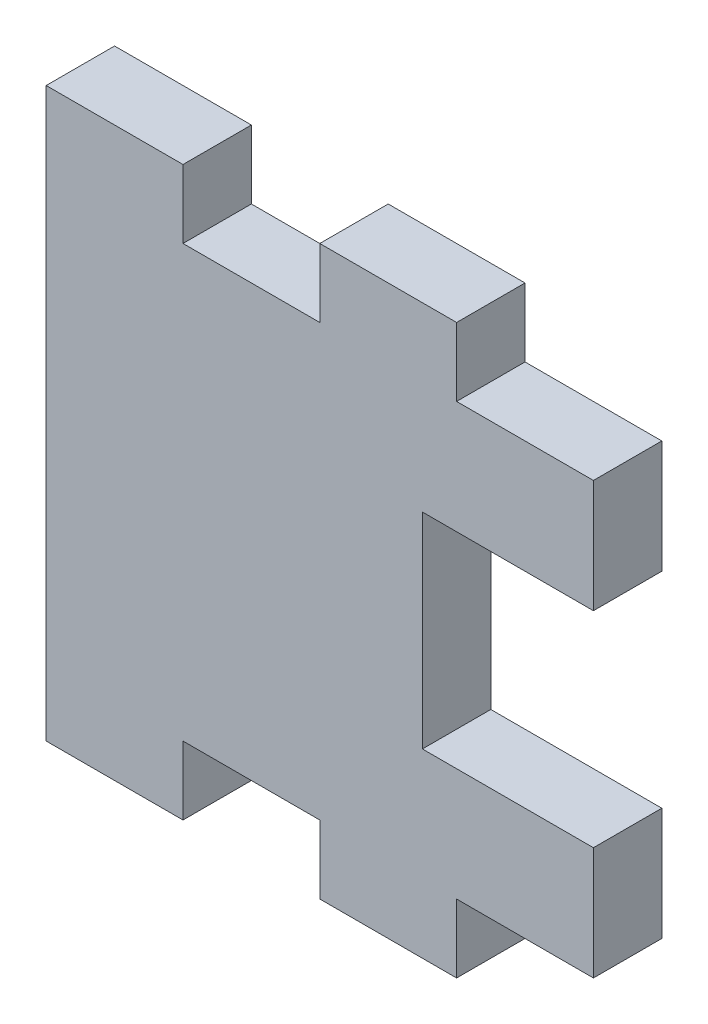
ISO-10303-21;
HEADER;
FILE_DESCRIPTION(('STEP AP214'),'2;1');
FILE_NAME('part.step','',(''),(''),'','','');
FILE_SCHEMA(('AUTOMOTIVE_DESIGN { 1 0 10303 214 1 1 1 1 }'));
ENDSEC;
DATA;
#1=APPLICATION_CONTEXT('core data for automotive mechanical design processes');
#2=APPLICATION_PROTOCOL_DEFINITION('international standard','automotive_design',2000,#1);
#3=PRODUCT_CONTEXT('',#1,'mechanical');
#4=PRODUCT('Part','Part','',(#3));
#5=PRODUCT_RELATED_PRODUCT_CATEGORY('part','',(#4));
#6=PRODUCT_DEFINITION_FORMATION('','',#4);
#7=PRODUCT_DEFINITION_CONTEXT('part definition',#1,'design');
#8=PRODUCT_DEFINITION('design','',#6,#7);
#9=PRODUCT_DEFINITION_SHAPE('','',#8);
#10=(LENGTH_UNIT() NAMED_UNIT(*) SI_UNIT(.MILLI.,.METRE.));
#11=(NAMED_UNIT(*) PLANE_ANGLE_UNIT() SI_UNIT($,.RADIAN.));
#12=(NAMED_UNIT(*) SI_UNIT($,.STERADIAN.) SOLID_ANGLE_UNIT());
#13=UNCERTAINTY_MEASURE_WITH_UNIT(LENGTH_MEASURE(1.E-05),#10,'distance_accuracy_value','');
#14=(GEOMETRIC_REPRESENTATION_CONTEXT(3) GLOBAL_UNCERTAINTY_ASSIGNED_CONTEXT((#13)) GLOBAL_UNIT_ASSIGNED_CONTEXT((#10,
#11,#12)) REPRESENTATION_CONTEXT('',''));
#15=CARTESIAN_POINT('',(0.,0.,0.));
#16=DIRECTION('',(0.,0.,1.));
#17=DIRECTION('',(1.,0.,0.));
#18=AXIS2_PLACEMENT_3D('',#15,#16,#17);
#19=CARTESIAN_POINT('',(0.,-3.175,3.175));
#20=DIRECTION('',(0.,1.,0.));
#21=DIRECTION('',(0.,0.,1.));
#22=AXIS2_PLACEMENT_3D('',#19,#20,#21);
#23=PLANE('',#22);
#24=DIRECTION('',(1.,0.,0.));
#25=VECTOR('',#24,1.);
#26=CARTESIAN_POINT('',(0.,-3.175,0.));
#27=LINE('',#26,#25);
#28=CARTESIAN_POINT('',(0.,-3.175,0.));
#29=VERTEX_POINT('',#28);
#30=CARTESIAN_POINT('',(6.35,-3.175,0.));
#31=VERTEX_POINT('',#30);
#32=EDGE_CURVE('E204',#29,#31,#27,.T.);
#33=ORIENTED_EDGE('',*,*,#32,.T.);
#34=DIRECTION('',(0.,0.,-1.));
#35=VECTOR('',#34,1.);
#36=CARTESIAN_POINT('',(6.35,-3.175,3.175));
#37=LINE('',#36,#35);
#38=CARTESIAN_POINT('',(6.35,-3.175,3.175));
#39=VERTEX_POINT('',#38);
#40=EDGE_CURVE('E43',#39,#31,#37,.T.);
#41=ORIENTED_EDGE('',*,*,#40,.F.);
#42=DIRECTION('',(1.,0.,0.));
#43=VECTOR('',#42,1.);
#44=CARTESIAN_POINT('',(0.,-3.175,3.175));
#45=LINE('',#44,#43);
#46=CARTESIAN_POINT('',(0.,-3.175,3.175));
#47=VERTEX_POINT('',#46);
#48=EDGE_CURVE('E349',#47,#39,#45,.T.);
#49=ORIENTED_EDGE('',*,*,#48,.F.);
#50=DIRECTION('',(0.,0.,-1.));
#51=VECTOR('',#50,1.);
#52=CARTESIAN_POINT('',(0.,-3.175,3.175));
#53=LINE('',#52,#51);
#54=EDGE_CURVE('E11',#47,#29,#53,.T.);
#55=ORIENTED_EDGE('',*,*,#54,.T.);
#56=EDGE_LOOP('',(#33,#41,#49,#55));
#57=FACE_BOUND('',#56,.T.);
#58=ADVANCED_FACE('F35',(#57),#23,.F.);
#59=CARTESIAN_POINT('',(6.35,-3.175,3.175));
#60=DIRECTION('',(-1.,0.,0.));
#61=DIRECTION('',(0.,0.,1.));
#62=AXIS2_PLACEMENT_3D('',#59,#60,#61);
#63=PLANE('',#62);
#64=DIRECTION('',(0.,1.,0.));
#65=VECTOR('',#64,1.);
#66=CARTESIAN_POINT('',(6.35,-3.175,0.));
#67=LINE('',#66,#65);
#68=CARTESIAN_POINT('',(6.35,0.,0.));
#69=VERTEX_POINT('',#68);
#70=EDGE_CURVE('E206',#31,#69,#67,.T.);
#71=ORIENTED_EDGE('',*,*,#70,.T.);
#72=DIRECTION('',(0.,0.,-1.));
#73=VECTOR('',#72,1.);
#74=CARTESIAN_POINT('',(6.35,0.,3.175));
#75=LINE('',#74,#73);
#76=CARTESIAN_POINT('',(6.35,0.,3.175));
#77=VERTEX_POINT('',#76);
#78=EDGE_CURVE('E283',#77,#69,#75,.T.);
#79=ORIENTED_EDGE('',*,*,#78,.F.);
#80=DIRECTION('',(0.,1.,0.));
#81=VECTOR('',#80,1.);
#82=CARTESIAN_POINT('',(6.35,-3.175,3.175));
#83=LINE('',#82,#81);
#84=EDGE_CURVE('E292',#39,#77,#83,.T.);
#85=ORIENTED_EDGE('',*,*,#84,.F.);
#86=ORIENTED_EDGE('',*,*,#40,.T.);
#87=EDGE_LOOP('',(#71,#79,#85,#86));
#88=FACE_BOUND('',#87,.T.);
#89=ADVANCED_FACE('F290',(#88),#63,.F.);
#90=CARTESIAN_POINT('',(6.35,0.,3.175));
#91=DIRECTION('',(0.,1.,0.));
#92=DIRECTION('',(0.,0.,1.));
#93=AXIS2_PLACEMENT_3D('',#90,#91,#92);
#94=PLANE('',#93);
#95=DIRECTION('',(1.,0.,0.));
#96=VECTOR('',#95,1.);
#97=CARTESIAN_POINT('',(6.35,0.,0.));
#98=LINE('',#97,#96);
#99=CARTESIAN_POINT('',(12.7,0.,0.));
#100=VERTEX_POINT('',#99);
#101=EDGE_CURVE('E208',#69,#100,#98,.T.);
#102=ORIENTED_EDGE('',*,*,#101,.T.);
#103=DIRECTION('',(0.,0.,-1.));
#104=VECTOR('',#103,1.);
#105=CARTESIAN_POINT('',(12.7,0.,3.175));
#106=LINE('',#105,#104);
#107=CARTESIAN_POINT('',(12.7,0.,3.175));
#108=VERTEX_POINT('',#107);
#109=EDGE_CURVE('E280',#108,#100,#106,.T.);
#110=ORIENTED_EDGE('',*,*,#109,.F.);
#111=DIRECTION('',(1.,0.,0.));
#112=VECTOR('',#111,1.);
#113=CARTESIAN_POINT('',(6.35,0.,3.175));
#114=LINE('',#113,#112);
#115=EDGE_CURVE('E310',#77,#108,#114,.T.);
#116=ORIENTED_EDGE('',*,*,#115,.F.);
#117=ORIENTED_EDGE('',*,*,#78,.T.);
#118=EDGE_LOOP('',(#102,#110,#116,#117));
#119=FACE_BOUND('',#118,.T.);
#120=ADVANCED_FACE('F301',(#119),#94,.F.);
#121=CARTESIAN_POINT('',(12.7,0.,3.175));
#122=DIRECTION('',(1.,0.,0.));
#123=DIRECTION('',(0.,0.,-1.));
#124=AXIS2_PLACEMENT_3D('',#121,#122,#123);
#125=PLANE('',#124);
#126=DIRECTION('',(0.,-1.,0.));
#127=VECTOR('',#126,1.);
#128=CARTESIAN_POINT('',(12.7,0.,0.));
#129=LINE('',#128,#127);
#130=CARTESIAN_POINT('',(12.7,-3.175,0.));
#131=VERTEX_POINT('',#130);
#132=EDGE_CURVE('E210',#100,#131,#129,.T.);
#133=ORIENTED_EDGE('',*,*,#132,.T.);
#134=DIRECTION('',(0.,0.,-1.));
#135=VECTOR('',#134,1.);
#136=CARTESIAN_POINT('',(12.7,-3.175,3.175));
#137=LINE('',#136,#135);
#138=CARTESIAN_POINT('',(12.7,-3.175,3.175));
#139=VERTEX_POINT('',#138);
#140=EDGE_CURVE('E277',#139,#131,#137,.T.);
#141=ORIENTED_EDGE('',*,*,#140,.F.);
#142=DIRECTION('',(0.,-1.,0.));
#143=VECTOR('',#142,1.);
#144=CARTESIAN_POINT('',(12.7,0.,3.175));
#145=LINE('',#144,#143);
#146=EDGE_CURVE('E307',#108,#139,#145,.T.);
#147=ORIENTED_EDGE('',*,*,#146,.F.);
#148=ORIENTED_EDGE('',*,*,#109,.T.);
#149=EDGE_LOOP('',(#133,#141,#147,#148));
#150=FACE_BOUND('',#149,.T.);
#151=ADVANCED_FACE('F305',(#150),#125,.F.);
#152=CARTESIAN_POINT('',(12.7,-3.175,3.175));
#153=DIRECTION('',(0.,1.,0.));
#154=DIRECTION('',(-1.,0.,0.));
#155=AXIS2_PLACEMENT_3D('',#152,#153,#154);
#156=PLANE('',#155);
#157=DIRECTION('',(1.,0.,0.));
#158=VECTOR('',#157,1.);
#159=CARTESIAN_POINT('',(12.7,-3.175,0.));
#160=LINE('',#159,#158);
#161=CARTESIAN_POINT('',(19.05,-3.175,0.));
#162=VERTEX_POINT('',#161);
#163=EDGE_CURVE('E212',#131,#162,#160,.T.);
#164=ORIENTED_EDGE('',*,*,#163,.T.);
#165=DIRECTION('',(0.,0.,-1.));
#166=VECTOR('',#165,1.);
#167=CARTESIAN_POINT('',(19.05,-3.175,3.175));
#168=LINE('',#167,#166);
#169=CARTESIAN_POINT('',(19.05,-3.175,3.175));
#170=VERTEX_POINT('',#169);
#171=EDGE_CURVE('E274',#170,#162,#168,.T.);
#172=ORIENTED_EDGE('',*,*,#171,.F.);
#173=DIRECTION('',(1.,0.,0.));
#174=VECTOR('',#173,1.);
#175=CARTESIAN_POINT('',(12.7,-3.175,3.175));
#176=LINE('',#175,#174);
#177=EDGE_CURVE('E309',#139,#170,#176,.T.);
#178=ORIENTED_EDGE('',*,*,#177,.F.);
#179=ORIENTED_EDGE('',*,*,#140,.T.);
#180=EDGE_LOOP('',(#164,#172,#178,#179));
#181=FACE_BOUND('',#180,.T.);
#182=ADVANCED_FACE('F363',(#181),#156,.F.);
#183=CARTESIAN_POINT('',(19.05,-3.175,3.175));
#184=DIRECTION('',(-1.,0.,0.));
#185=DIRECTION('',(0.,0.,1.));
#186=AXIS2_PLACEMENT_3D('',#183,#184,#185);
#187=PLANE('',#186);
#188=DIRECTION('',(0.,1.,0.));
#189=VECTOR('',#188,1.);
#190=CARTESIAN_POINT('',(19.05,-3.175,0.));
#191=LINE('',#190,#189);
#192=CARTESIAN_POINT('',(19.05,0.,0.));
#193=VERTEX_POINT('',#192);
#194=EDGE_CURVE('E214',#162,#193,#191,.T.);
#195=ORIENTED_EDGE('',*,*,#194,.T.);
#196=DIRECTION('',(0.,0.,-1.));
#197=VECTOR('',#196,1.);
#198=CARTESIAN_POINT('',(19.05,0.,3.175));
#199=LINE('',#198,#197);
#200=CARTESIAN_POINT('',(19.05,0.,3.175));
#201=VERTEX_POINT('',#200);
#202=EDGE_CURVE('E271',#201,#193,#199,.T.);
#203=ORIENTED_EDGE('',*,*,#202,.F.);
#204=DIRECTION('',(0.,1.,0.));
#205=VECTOR('',#204,1.);
#206=CARTESIAN_POINT('',(19.05,-3.175,3.175));
#207=LINE('',#206,#205);
#208=EDGE_CURVE('E312',#170,#201,#207,.T.);
#209=ORIENTED_EDGE('',*,*,#208,.F.);
#210=ORIENTED_EDGE('',*,*,#171,.T.);
#211=EDGE_LOOP('',(#195,#203,#209,#210));
#212=FACE_BOUND('',#211,.T.);
#213=ADVANCED_FACE('F366',(#212),#187,.F.);
#214=CARTESIAN_POINT('',(19.05,0.,3.175));
#215=DIRECTION('',(0.,1.,0.));
#216=DIRECTION('',(0.,0.,1.));
#217=AXIS2_PLACEMENT_3D('',#214,#215,#216);
#218=PLANE('',#217);
#219=DIRECTION('',(1.,0.,0.));
#220=VECTOR('',#219,1.);
#221=CARTESIAN_POINT('',(19.05,0.,0.));
#222=LINE('',#221,#220);
#223=CARTESIAN_POINT('',(25.4,0.,0.));
#224=VERTEX_POINT('',#223);
#225=EDGE_CURVE('E216',#193,#224,#222,.T.);
#226=ORIENTED_EDGE('',*,*,#225,.T.);
#227=DIRECTION('',(0.,0.,-1.));
#228=VECTOR('',#227,1.);
#229=CARTESIAN_POINT('',(25.4,0.,3.175));
#230=LINE('',#229,#228);
#231=CARTESIAN_POINT('',(25.4,0.,3.175));
#232=VERTEX_POINT('',#231);
#233=EDGE_CURVE('E268',#232,#224,#230,.T.);
#234=ORIENTED_EDGE('',*,*,#233,.F.);
#235=DIRECTION('',(1.,0.,0.));
#236=VECTOR('',#235,1.);
#237=CARTESIAN_POINT('',(19.05,0.,3.175));
#238=LINE('',#237,#236);
#239=EDGE_CURVE('E318',#201,#232,#238,.T.);
#240=ORIENTED_EDGE('',*,*,#239,.F.);
#241=ORIENTED_EDGE('',*,*,#202,.T.);
#242=EDGE_LOOP('',(#226,#234,#240,#241));
#243=FACE_BOUND('',#242,.T.);
#244=ADVANCED_FACE('F370',(#243),#218,.F.);
#245=CARTESIAN_POINT('',(25.4,0.,3.175));
#246=DIRECTION('',(-1.,0.,0.));
#247=DIRECTION('',(0.,-1.,0.));
#248=AXIS2_PLACEMENT_3D('',#245,#246,#247);
#249=PLANE('',#248);
#250=DIRECTION('',(0.,1.,0.));
#251=VECTOR('',#250,1.);
#252=CARTESIAN_POINT('',(25.4,0.,0.));
#253=LINE('',#252,#251);
#254=CARTESIAN_POINT('',(25.4,5.2375,0.));
#255=VERTEX_POINT('',#254);
#256=EDGE_CURVE('E218',#224,#255,#253,.T.);
#257=ORIENTED_EDGE('',*,*,#256,.T.);
#258=DIRECTION('',(0.,0.,-1.));
#259=VECTOR('',#258,1.);
#260=CARTESIAN_POINT('',(25.4,5.2375,3.175));
#261=LINE('',#260,#259);
#262=CARTESIAN_POINT('',(25.4,5.2375,3.175));
#263=VERTEX_POINT('',#262);
#264=EDGE_CURVE('E265',#263,#255,#261,.T.);
#265=ORIENTED_EDGE('',*,*,#264,.F.);
#266=DIRECTION('',(0.,1.,0.));
#267=VECTOR('',#266,1.);
#268=CARTESIAN_POINT('',(25.4,0.,3.175));
#269=LINE('',#268,#267);
#270=EDGE_CURVE('E320',#232,#263,#269,.T.);
#271=ORIENTED_EDGE('',*,*,#270,.F.);
#272=ORIENTED_EDGE('',*,*,#233,.T.);
#273=EDGE_LOOP('',(#257,#265,#271,#272));
#274=FACE_BOUND('',#273,.T.);
#275=ADVANCED_FACE('F374',(#274),#249,.F.);
#276=CARTESIAN_POINT('',(25.4,5.2375,3.175));
#277=DIRECTION('',(0.,-1.,0.));
#278=DIRECTION('',(1.,0.,0.));
#279=AXIS2_PLACEMENT_3D('',#276,#277,#278);
#280=PLANE('',#279);
#281=DIRECTION('',(-1.,0.,0.));
#282=VECTOR('',#281,1.);
#283=CARTESIAN_POINT('',(25.4,5.2375,0.));
#284=LINE('',#283,#282);
#285=CARTESIAN_POINT('',(17.4625,5.2375,0.));
#286=VERTEX_POINT('',#285);
#287=EDGE_CURVE('E220',#255,#286,#284,.T.);
#288=ORIENTED_EDGE('',*,*,#287,.T.);
#289=DIRECTION('',(0.,0.,-1.));
#290=VECTOR('',#289,1.);
#291=CARTESIAN_POINT('',(17.4625,5.2375,3.175));
#292=LINE('',#291,#290);
#293=CARTESIAN_POINT('',(17.4625,5.2375,3.175));
#294=VERTEX_POINT('',#293);
#295=EDGE_CURVE('E262',#294,#286,#292,.T.);
#296=ORIENTED_EDGE('',*,*,#295,.F.);
#297=DIRECTION('',(-1.,0.,0.));
#298=VECTOR('',#297,1.);
#299=CARTESIAN_POINT('',(25.4,5.2375,3.175));
#300=LINE('',#299,#298);
#301=EDGE_CURVE('E322',#263,#294,#300,.T.);
#302=ORIENTED_EDGE('',*,*,#301,.F.);
#303=ORIENTED_EDGE('',*,*,#264,.T.);
#304=EDGE_LOOP('',(#288,#296,#302,#303));
#305=FACE_BOUND('',#304,.T.);
#306=ADVANCED_FACE('F378',(#305),#280,.F.);
#307=CARTESIAN_POINT('',(17.4625,14.7625,3.175));
#308=DIRECTION('',(-1.,0.,0.));
#309=DIRECTION('',(0.,-1.,0.));
#310=AXIS2_PLACEMENT_3D('',#307,#308,#309);
#311=PLANE('',#310);
#312=DIRECTION('',(0.,1.,0.));
#313=VECTOR('',#312,1.);
#314=CARTESIAN_POINT('',(17.4625,14.7625,0.));
#315=LINE('',#314,#313);
#316=CARTESIAN_POINT('',(17.4625,14.7625,0.));
#317=VERTEX_POINT('',#316);
#318=EDGE_CURVE('E222',#286,#317,#315,.T.);
#319=ORIENTED_EDGE('',*,*,#318,.T.);
#320=DIRECTION('',(0.,0.,-1.));
#321=VECTOR('',#320,1.);
#322=CARTESIAN_POINT('',(17.4625,14.7625,3.175));
#323=LINE('',#322,#321);
#324=CARTESIAN_POINT('',(17.4625,14.7625,3.175));
#325=VERTEX_POINT('',#324);
#326=EDGE_CURVE('E259',#325,#317,#323,.T.);
#327=ORIENTED_EDGE('',*,*,#326,.F.);
#328=DIRECTION('',(0.,1.,0.));
#329=VECTOR('',#328,1.);
#330=CARTESIAN_POINT('',(17.4625,14.7625,3.175));
#331=LINE('',#330,#329);
#332=EDGE_CURVE('E324',#294,#325,#331,.T.);
#333=ORIENTED_EDGE('',*,*,#332,.F.);
#334=ORIENTED_EDGE('',*,*,#295,.T.);
#335=EDGE_LOOP('',(#319,#327,#333,#334));
#336=FACE_BOUND('',#335,.T.);
#337=ADVANCED_FACE('F382',(#336),#311,.F.);
#338=CARTESIAN_POINT('',(25.4,14.7625,3.175));
#339=DIRECTION('',(0.,1.,0.));
#340=DIRECTION('',(-1.,0.,0.));
#341=AXIS2_PLACEMENT_3D('',#338,#339,#340);
#342=PLANE('',#341);
#343=DIRECTION('',(1.,0.,0.));
#344=VECTOR('',#343,1.);
#345=CARTESIAN_POINT('',(25.4,14.7625,0.));
#346=LINE('',#345,#344);
#347=CARTESIAN_POINT('',(25.4,14.7625,0.));
#348=VERTEX_POINT('',#347);
#349=EDGE_CURVE('E224',#317,#348,#346,.T.);
#350=ORIENTED_EDGE('',*,*,#349,.T.);
#351=DIRECTION('',(0.,0.,-1.));
#352=VECTOR('',#351,1.);
#353=CARTESIAN_POINT('',(25.4,14.7625,3.175));
#354=LINE('',#353,#352);
#355=CARTESIAN_POINT('',(25.4,14.7625,3.175));
#356=VERTEX_POINT('',#355);
#357=EDGE_CURVE('E256',#356,#348,#354,.T.);
#358=ORIENTED_EDGE('',*,*,#357,.F.);
#359=DIRECTION('',(1.,0.,0.));
#360=VECTOR('',#359,1.);
#361=CARTESIAN_POINT('',(25.4,14.7625,3.175));
#362=LINE('',#361,#360);
#363=EDGE_CURVE('E326',#325,#356,#362,.T.);
#364=ORIENTED_EDGE('',*,*,#363,.F.);
#365=ORIENTED_EDGE('',*,*,#326,.T.);
#366=EDGE_LOOP('',(#350,#358,#364,#365));
#367=FACE_BOUND('',#366,.T.);
#368=ADVANCED_FACE('F386',(#367),#342,.F.);
#369=CARTESIAN_POINT('',(25.4,14.7625,3.175));
#370=DIRECTION('',(-1.,0.,0.));
#371=DIRECTION('',(0.,0.,1.));
#372=AXIS2_PLACEMENT_3D('',#369,#370,#371);
#373=PLANE('',#372);
#374=DIRECTION('',(0.,1.,0.));
#375=VECTOR('',#374,1.);
#376=CARTESIAN_POINT('',(25.4,14.7625,0.));
#377=LINE('',#376,#375);
#378=CARTESIAN_POINT('',(25.4,20.,0.));
#379=VERTEX_POINT('',#378);
#380=EDGE_CURVE('E226',#348,#379,#377,.T.);
#381=ORIENTED_EDGE('',*,*,#380,.T.);
#382=DIRECTION('',(0.,0.,-1.));
#383=VECTOR('',#382,1.);
#384=CARTESIAN_POINT('',(25.4,20.,3.175));
#385=LINE('',#384,#383);
#386=CARTESIAN_POINT('',(25.4,20.,3.175));
#387=VERTEX_POINT('',#386);
#388=EDGE_CURVE('E253',#387,#379,#385,.T.);
#389=ORIENTED_EDGE('',*,*,#388,.F.);
#390=DIRECTION('',(0.,1.,0.));
#391=VECTOR('',#390,1.);
#392=CARTESIAN_POINT('',(25.4,14.7625,3.175));
#393=LINE('',#392,#391);
#394=EDGE_CURVE('E328',#356,#387,#393,.T.);
#395=ORIENTED_EDGE('',*,*,#394,.F.);
#396=ORIENTED_EDGE('',*,*,#357,.T.);
#397=EDGE_LOOP('',(#381,#389,#395,#396));
#398=FACE_BOUND('',#397,.T.);
#399=ADVANCED_FACE('F390',(#398),#373,.F.);
#400=CARTESIAN_POINT('',(19.05,20.,3.175));
#401=DIRECTION('',(0.,-1.,0.));
#402=DIRECTION('',(0.,0.,-1.));
#403=AXIS2_PLACEMENT_3D('',#400,#401,#402);
#404=PLANE('',#403);
#405=DIRECTION('',(-1.,0.,0.));
#406=VECTOR('',#405,1.);
#407=CARTESIAN_POINT('',(19.05,20.,0.));
#408=LINE('',#407,#406);
#409=CARTESIAN_POINT('',(19.05,20.,0.));
#410=VERTEX_POINT('',#409);
#411=EDGE_CURVE('E228',#379,#410,#408,.T.);
#412=ORIENTED_EDGE('',*,*,#411,.T.);
#413=DIRECTION('',(0.,0.,-1.));
#414=VECTOR('',#413,1.);
#415=CARTESIAN_POINT('',(19.05,20.,3.175));
#416=LINE('',#415,#414);
#417=CARTESIAN_POINT('',(19.05,20.,3.175));
#418=VERTEX_POINT('',#417);
#419=EDGE_CURVE('E250',#418,#410,#416,.T.);
#420=ORIENTED_EDGE('',*,*,#419,.F.);
#421=DIRECTION('',(-1.,0.,0.));
#422=VECTOR('',#421,1.);
#423=CARTESIAN_POINT('',(19.05,20.,3.175));
#424=LINE('',#423,#422);
#425=EDGE_CURVE('E330',#387,#418,#424,.T.);
#426=ORIENTED_EDGE('',*,*,#425,.F.);
#427=ORIENTED_EDGE('',*,*,#388,.T.);
#428=EDGE_LOOP('',(#412,#420,#426,#427));
#429=FACE_BOUND('',#428,.T.);
#430=ADVANCED_FACE('F394',(#429),#404,.F.);
#431=CARTESIAN_POINT('',(19.05,23.175,3.175));
#432=DIRECTION('',(-1.,0.,0.));
#433=DIRECTION('',(0.,0.,1.));
#434=AXIS2_PLACEMENT_3D('',#431,#432,#433);
#435=PLANE('',#434);
#436=DIRECTION('',(0.,1.,0.));
#437=VECTOR('',#436,1.);
#438=CARTESIAN_POINT('',(19.05,23.175,0.));
#439=LINE('',#438,#437);
#440=CARTESIAN_POINT('',(19.05,23.175,0.));
#441=VERTEX_POINT('',#440);
#442=EDGE_CURVE('E230',#410,#441,#439,.T.);
#443=ORIENTED_EDGE('',*,*,#442,.T.);
#444=DIRECTION('',(0.,0.,-1.));
#445=VECTOR('',#444,1.);
#446=CARTESIAN_POINT('',(19.05,23.175,3.175));
#447=LINE('',#446,#445);
#448=CARTESIAN_POINT('',(19.05,23.175,3.175));
#449=VERTEX_POINT('',#448);
#450=EDGE_CURVE('E247',#449,#441,#447,.T.);
#451=ORIENTED_EDGE('',*,*,#450,.F.);
#452=DIRECTION('',(0.,1.,0.));
#453=VECTOR('',#452,1.);
#454=CARTESIAN_POINT('',(19.05,23.175,3.175));
#455=LINE('',#454,#453);
#456=EDGE_CURVE('E332',#418,#449,#455,.T.);
#457=ORIENTED_EDGE('',*,*,#456,.F.);
#458=ORIENTED_EDGE('',*,*,#419,.T.);
#459=EDGE_LOOP('',(#443,#451,#457,#458));
#460=FACE_BOUND('',#459,.T.);
#461=ADVANCED_FACE('F398',(#460),#435,.F.);
#462=CARTESIAN_POINT('',(12.7,23.175,3.175));
#463=DIRECTION('',(0.,-1.,0.));
#464=DIRECTION('',(1.,0.,0.));
#465=AXIS2_PLACEMENT_3D('',#462,#463,#464);
#466=PLANE('',#465);
#467=DIRECTION('',(-1.,0.,0.));
#468=VECTOR('',#467,1.);
#469=CARTESIAN_POINT('',(12.7,23.175,0.));
#470=LINE('',#469,#468);
#471=CARTESIAN_POINT('',(12.7,23.175,0.));
#472=VERTEX_POINT('',#471);
#473=EDGE_CURVE('E232',#441,#472,#470,.T.);
#474=ORIENTED_EDGE('',*,*,#473,.T.);
#475=DIRECTION('',(0.,0.,-1.));
#476=VECTOR('',#475,1.);
#477=CARTESIAN_POINT('',(12.7,23.175,3.175));
#478=LINE('',#477,#476);
#479=CARTESIAN_POINT('',(12.7,23.175,3.175));
#480=VERTEX_POINT('',#479);
#481=EDGE_CURVE('E244',#480,#472,#478,.T.);
#482=ORIENTED_EDGE('',*,*,#481,.F.);
#483=DIRECTION('',(-1.,0.,0.));
#484=VECTOR('',#483,1.);
#485=CARTESIAN_POINT('',(12.7,23.175,3.175));
#486=LINE('',#485,#484);
#487=EDGE_CURVE('E334',#449,#480,#486,.T.);
#488=ORIENTED_EDGE('',*,*,#487,.F.);
#489=ORIENTED_EDGE('',*,*,#450,.T.);
#490=EDGE_LOOP('',(#474,#482,#488,#489));
#491=FACE_BOUND('',#490,.T.);
#492=ADVANCED_FACE('F340',(#491),#466,.F.);
#493=CARTESIAN_POINT('',(12.7,20.,3.175));
#494=DIRECTION('',(1.,0.,0.));
#495=DIRECTION('',(0.,0.,-1.));
#496=AXIS2_PLACEMENT_3D('',#493,#494,#495);
#497=PLANE('',#496);
#498=DIRECTION('',(0.,-1.,0.));
#499=VECTOR('',#498,1.);
#500=CARTESIAN_POINT('',(12.7,20.,0.));
#501=LINE('',#500,#499);
#502=CARTESIAN_POINT('',(12.7,20.,0.));
#503=VERTEX_POINT('',#502);
#504=EDGE_CURVE('E234',#472,#503,#501,.T.);
#505=ORIENTED_EDGE('',*,*,#504,.T.);
#506=DIRECTION('',(0.,0.,-1.));
#507=VECTOR('',#506,1.);
#508=CARTESIAN_POINT('',(12.7,20.,3.175));
#509=LINE('',#508,#507);
#510=CARTESIAN_POINT('',(12.7,20.,3.175));
#511=VERTEX_POINT('',#510);
#512=EDGE_CURVE('E193',#511,#503,#509,.T.);
#513=ORIENTED_EDGE('',*,*,#512,.F.);
#514=DIRECTION('',(0.,-1.,0.));
#515=VECTOR('',#514,1.);
#516=CARTESIAN_POINT('',(12.7,20.,3.175));
#517=LINE('',#516,#515);
#518=EDGE_CURVE('E184',#480,#511,#517,.T.);
#519=ORIENTED_EDGE('',*,*,#518,.F.);
#520=ORIENTED_EDGE('',*,*,#481,.T.);
#521=EDGE_LOOP('',(#505,#513,#519,#520));
#522=FACE_BOUND('',#521,.T.);
#523=ADVANCED_FACE('F344',(#522),#497,.F.);
#524=CARTESIAN_POINT('',(6.35,20.,3.175));
#525=DIRECTION('',(0.,-1.,0.));
#526=DIRECTION('',(0.,0.,-1.));
#527=AXIS2_PLACEMENT_3D('',#524,#525,#526);
#528=PLANE('',#527);
#529=DIRECTION('',(-1.,0.,0.));
#530=VECTOR('',#529,1.);
#531=CARTESIAN_POINT('',(6.35,20.,0.));
#532=LINE('',#531,#530);
#533=CARTESIAN_POINT('',(6.35,20.,0.));
#534=VERTEX_POINT('',#533);
#535=EDGE_CURVE('E192',#503,#534,#532,.T.);
#536=ORIENTED_EDGE('',*,*,#535,.T.);
#537=DIRECTION('',(0.,0.,-1.));
#538=VECTOR('',#537,1.);
#539=CARTESIAN_POINT('',(6.35,20.,3.175));
#540=LINE('',#539,#538);
#541=CARTESIAN_POINT('',(6.35,20.,3.175));
#542=VERTEX_POINT('',#541);
#543=EDGE_CURVE('E189',#542,#534,#540,.T.);
#544=ORIENTED_EDGE('',*,*,#543,.F.);
#545=DIRECTION('',(-1.,0.,0.));
#546=VECTOR('',#545,1.);
#547=CARTESIAN_POINT('',(6.35,20.,3.175));
#548=LINE('',#547,#546);
#549=EDGE_CURVE('E178',#511,#542,#548,.T.);
#550=ORIENTED_EDGE('',*,*,#549,.F.);
#551=ORIENTED_EDGE('',*,*,#512,.T.);
#552=EDGE_LOOP('',(#536,#544,#550,#551));
#553=FACE_BOUND('',#552,.T.);
#554=ADVANCED_FACE('F190',(#553),#528,.F.);
#555=CARTESIAN_POINT('',(6.35,23.175,3.175));
#556=DIRECTION('',(-1.,0.,0.));
#557=DIRECTION('',(0.,0.,1.));
#558=AXIS2_PLACEMENT_3D('',#555,#556,#557);
#559=PLANE('',#558);
#560=DIRECTION('',(0.,1.,0.));
#561=VECTOR('',#560,1.);
#562=CARTESIAN_POINT('',(6.35,23.175,0.));
#563=LINE('',#562,#561);
#564=CARTESIAN_POINT('',(6.35,23.175,0.));
#565=VERTEX_POINT('',#564);
#566=EDGE_CURVE('E117',#534,#565,#563,.T.);
#567=ORIENTED_EDGE('',*,*,#566,.T.);
#568=DIRECTION('',(0.,0.,-1.));
#569=VECTOR('',#568,1.);
#570=CARTESIAN_POINT('',(6.35,23.175,3.175));
#571=LINE('',#570,#569);
#572=CARTESIAN_POINT('',(6.35,23.175,3.175));
#573=VERTEX_POINT('',#572);
#574=EDGE_CURVE('E194',#573,#565,#571,.T.);
#575=ORIENTED_EDGE('',*,*,#574,.F.);
#576=DIRECTION('',(0.,1.,0.));
#577=VECTOR('',#576,1.);
#578=CARTESIAN_POINT('',(6.35,23.175,3.175));
#579=LINE('',#578,#577);
#580=EDGE_CURVE('E182',#542,#573,#579,.T.);
#581=ORIENTED_EDGE('',*,*,#580,.F.);
#582=ORIENTED_EDGE('',*,*,#543,.T.);
#583=EDGE_LOOP('',(#567,#575,#581,#582));
#584=FACE_BOUND('',#583,.T.);
#585=ADVANCED_FACE('F196',(#584),#559,.F.);
#586=CARTESIAN_POINT('',(0.,23.175,3.175));
#587=DIRECTION('',(0.,-1.,0.));
#588=DIRECTION('',(0.,0.,-1.));
#589=AXIS2_PLACEMENT_3D('',#586,#587,#588);
#590=PLANE('',#589);
#591=DIRECTION('',(-1.,0.,0.));
#592=VECTOR('',#591,1.);
#593=CARTESIAN_POINT('',(0.,23.175,0.));
#594=LINE('',#593,#592);
#595=CARTESIAN_POINT('',(0.,23.175,0.));
#596=VERTEX_POINT('',#595);
#597=EDGE_CURVE('E238',#565,#596,#594,.T.);
#598=ORIENTED_EDGE('',*,*,#597,.T.);
#599=DIRECTION('',(0.,0.,-1.));
#600=VECTOR('',#599,1.);
#601=CARTESIAN_POINT('',(0.,23.175,3.175));
#602=LINE('',#601,#600);
#603=CARTESIAN_POINT('',(0.,23.175,3.175));
#604=VERTEX_POINT('',#603);
#605=EDGE_CURVE('E200',#604,#596,#602,.T.);
#606=ORIENTED_EDGE('',*,*,#605,.F.);
#607=DIRECTION('',(-1.,0.,0.));
#608=VECTOR('',#607,1.);
#609=CARTESIAN_POINT('',(0.,23.175,3.175));
#610=LINE('',#609,#608);
#611=EDGE_CURVE('E198',#573,#604,#610,.T.);
#612=ORIENTED_EDGE('',*,*,#611,.F.);
#613=ORIENTED_EDGE('',*,*,#574,.T.);
#614=EDGE_LOOP('',(#598,#606,#612,#613));
#615=FACE_BOUND('',#614,.T.);
#616=ADVANCED_FACE('F347',(#615),#590,.F.);
#617=CARTESIAN_POINT('',(0.,10.,3.175));
#618=DIRECTION('',(1.,0.,0.));
#619=DIRECTION('',(0.,0.,-1.));
#620=AXIS2_PLACEMENT_3D('',#617,#618,#619);
#621=PLANE('',#620);
#622=DIRECTION('',(0.,-1.,0.));
#623=VECTOR('',#622,1.);
#624=CARTESIAN_POINT('',(0.,10.,0.));
#625=LINE('',#624,#623);
#626=EDGE_CURVE('E124',#596,#29,#625,.T.);
#627=ORIENTED_EDGE('',*,*,#626,.T.);
#628=ORIENTED_EDGE('',*,*,#54,.F.);
#629=DIRECTION('',(0.,-1.,0.));
#630=VECTOR('',#629,1.);
#631=CARTESIAN_POINT('',(0.,0.,3.175));
#632=LINE('',#631,#630);
#633=EDGE_CURVE('E51',#604,#47,#632,.T.);
#634=ORIENTED_EDGE('',*,*,#633,.F.);
#635=ORIENTED_EDGE('',*,*,#605,.T.);
#636=EDGE_LOOP('',(#627,#628,#634,#635));
#637=FACE_BOUND('',#636,.T.);
#638=ADVANCED_FACE('F348',(#637),#621,.F.);
#639=CARTESIAN_POINT('',(0.,23.175,3.175));
#640=DIRECTION('',(0.,0.,-1.));
#641=DIRECTION('',(-1.,0.,0.));
#642=AXIS2_PLACEMENT_3D('',#639,#640,#641);
#643=PLANE('',#642);
#644=ORIENTED_EDGE('',*,*,#633,.T.);
#645=ORIENTED_EDGE('',*,*,#48,.T.);
#646=ORIENTED_EDGE('',*,*,#84,.T.);
#647=ORIENTED_EDGE('',*,*,#115,.T.);
#648=ORIENTED_EDGE('',*,*,#146,.T.);
#649=ORIENTED_EDGE('',*,*,#177,.T.);
#650=ORIENTED_EDGE('',*,*,#208,.T.);
#651=ORIENTED_EDGE('',*,*,#239,.T.);
#652=ORIENTED_EDGE('',*,*,#270,.T.);
#653=ORIENTED_EDGE('',*,*,#301,.T.);
#654=ORIENTED_EDGE('',*,*,#332,.T.);
#655=ORIENTED_EDGE('',*,*,#363,.T.);
#656=ORIENTED_EDGE('',*,*,#394,.T.);
#657=ORIENTED_EDGE('',*,*,#425,.T.);
#658=ORIENTED_EDGE('',*,*,#456,.T.);
#659=ORIENTED_EDGE('',*,*,#487,.T.);
#660=ORIENTED_EDGE('',*,*,#518,.T.);
#661=ORIENTED_EDGE('',*,*,#549,.T.);
#662=ORIENTED_EDGE('',*,*,#580,.T.);
#663=ORIENTED_EDGE('',*,*,#611,.T.);
#664=EDGE_LOOP('',(#644,#645,#646,#647,#648,#649,#650,#651,#652,#653,#654,#655,#656,#657,#658,
#659,#660,#661,#662,#663));
#665=FACE_BOUND('',#664,.T.);
#666=ADVANCED_FACE('F180',(#665),#643,.F.);
#667=CARTESIAN_POINT('',(0.,23.175,0.));
#668=DIRECTION('',(0.,0.,-1.));
#669=DIRECTION('',(-1.,0.,0.));
#670=AXIS2_PLACEMENT_3D('',#667,#668,#669);
#671=PLANE('',#670);
#672=ORIENTED_EDGE('',*,*,#32,.F.);
#673=ORIENTED_EDGE('',*,*,#626,.F.);
#674=ORIENTED_EDGE('',*,*,#597,.F.);
#675=ORIENTED_EDGE('',*,*,#566,.F.);
#676=ORIENTED_EDGE('',*,*,#535,.F.);
#677=ORIENTED_EDGE('',*,*,#504,.F.);
#678=ORIENTED_EDGE('',*,*,#473,.F.);
#679=ORIENTED_EDGE('',*,*,#442,.F.);
#680=ORIENTED_EDGE('',*,*,#411,.F.);
#681=ORIENTED_EDGE('',*,*,#380,.F.);
#682=ORIENTED_EDGE('',*,*,#349,.F.);
#683=ORIENTED_EDGE('',*,*,#318,.F.);
#684=ORIENTED_EDGE('',*,*,#287,.F.);
#685=ORIENTED_EDGE('',*,*,#256,.F.);
#686=ORIENTED_EDGE('',*,*,#225,.F.);
#687=ORIENTED_EDGE('',*,*,#194,.F.);
#688=ORIENTED_EDGE('',*,*,#163,.F.);
#689=ORIENTED_EDGE('',*,*,#132,.F.);
#690=ORIENTED_EDGE('',*,*,#101,.F.);
#691=ORIENTED_EDGE('',*,*,#70,.F.);
#692=EDGE_LOOP('',(#672,#673,#674,#675,#676,#677,#678,#679,#680,#681,#682,#683,#684,#685,#686,
#687,#688,#689,#690,#691));
#693=FACE_BOUND('',#692,.T.);
#694=ADVANCED_FACE('F296',(#693),#671,.T.);
#695=CLOSED_SHELL('',(#58,#89,#120,#151,#182,#213,#244,#275,#306,#337,#368,#399,#430,#461,#492,
#523,#554,#585,#616,#638,#666,#694));
#696=MANIFOLD_SOLID_BREP('B2',#695);
#697=ADVANCED_BREP_SHAPE_REPRESENTATION('',(#18,#696),#14);
#698=SHAPE_DEFINITION_REPRESENTATION(#9,#697);
ENDSEC;
END-ISO-10303-21;
